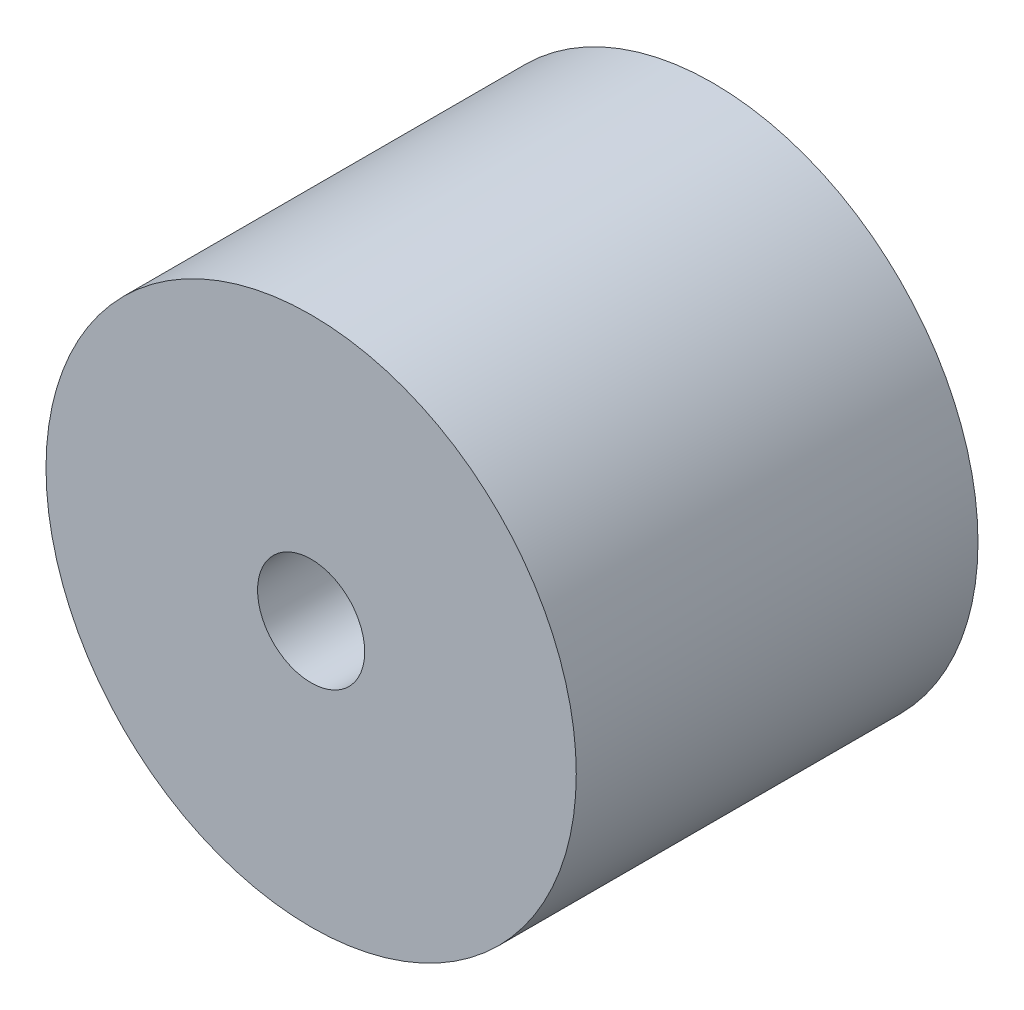
ISO-10303-21;
HEADER;
FILE_DESCRIPTION(('STEP AP214'),'2;1');
FILE_NAME('part.step','',(''),(''),'','','');
FILE_SCHEMA(('AUTOMOTIVE_DESIGN { 1 0 10303 214 1 1 1 1 }'));
ENDSEC;
DATA;
#1=APPLICATION_CONTEXT('core data for automotive mechanical design processes');
#2=APPLICATION_PROTOCOL_DEFINITION('international standard','automotive_design',2000,#1);
#3=PRODUCT_CONTEXT('',#1,'mechanical');
#4=PRODUCT('Part','Part','',(#3));
#5=PRODUCT_RELATED_PRODUCT_CATEGORY('part','',(#4));
#6=PRODUCT_DEFINITION_FORMATION('','',#4);
#7=PRODUCT_DEFINITION_CONTEXT('part definition',#1,'design');
#8=PRODUCT_DEFINITION('design','',#6,#7);
#9=PRODUCT_DEFINITION_SHAPE('','',#8);
#10=(LENGTH_UNIT() NAMED_UNIT(*) SI_UNIT(.MILLI.,.METRE.));
#11=(NAMED_UNIT(*) PLANE_ANGLE_UNIT() SI_UNIT($,.RADIAN.));
#12=(NAMED_UNIT(*) SI_UNIT($,.STERADIAN.) SOLID_ANGLE_UNIT());
#13=UNCERTAINTY_MEASURE_WITH_UNIT(LENGTH_MEASURE(1.E-05),#10,'distance_accuracy_value','');
#14=(GEOMETRIC_REPRESENTATION_CONTEXT(3) GLOBAL_UNCERTAINTY_ASSIGNED_CONTEXT((#13)) GLOBAL_UNIT_ASSIGNED_CONTEXT((#10,
#11,#12)) REPRESENTATION_CONTEXT('',''));
#15=CARTESIAN_POINT('',(0.,0.,0.));
#16=DIRECTION('',(0.,0.,1.));
#17=DIRECTION('',(1.,0.,0.));
#18=AXIS2_PLACEMENT_3D('',#15,#16,#17);
#19=CARTESIAN_POINT('',(0.,0.,15.));
#20=DIRECTION('',(0.,0.,1.));
#21=DIRECTION('',(1.,0.,0.));
#22=AXIS2_PLACEMENT_3D('',#19,#20,#21);
#23=PLANE('',#22);
#24=CARTESIAN_POINT('',(0.,0.,15.));
#25=DIRECTION('',(0.,0.,1.));
#26=DIRECTION('',(1.,0.,0.));
#27=AXIS2_PLACEMENT_3D('',#24,#25,#26);
#28=CIRCLE('',#27,9.9);
#29=CARTESIAN_POINT('',(9.9,0.,15.));
#30=VERTEX_POINT('',#29);
#31=EDGE_CURVE('E10',#30,#30,#28,.T.);
#32=ORIENTED_EDGE('',*,*,#31,.T.);
#33=EDGE_LOOP('',(#32));
#34=FACE_BOUND('',#33,.T.);
#35=CARTESIAN_POINT('',(0.,0.,15.));
#36=DIRECTION('',(0.,0.,1.));
#37=DIRECTION('',(1.,0.,0.));
#38=AXIS2_PLACEMENT_3D('',#35,#36,#37);
#39=CIRCLE('',#38,2.);
#40=CARTESIAN_POINT('',(2.,0.,15.));
#41=VERTEX_POINT('',#40);
#42=EDGE_CURVE('E45',#41,#41,#39,.T.);
#43=ORIENTED_EDGE('',*,*,#42,.F.);
#44=EDGE_LOOP('',(#43));
#45=FACE_BOUND('',#44,.T.);
#46=ADVANCED_FACE('F34',(#34,#45),#23,.T.);
#47=CARTESIAN_POINT('',(0.,0.,0.));
#48=DIRECTION('',(0.,0.,1.));
#49=DIRECTION('',(1.,0.,0.));
#50=AXIS2_PLACEMENT_3D('',#47,#48,#49);
#51=PLANE('',#50);
#52=CARTESIAN_POINT('',(0.,0.,0.));
#53=DIRECTION('',(0.,0.,1.));
#54=DIRECTION('',(1.,0.,0.));
#55=AXIS2_PLACEMENT_3D('',#52,#53,#54);
#56=CIRCLE('',#55,9.9);
#57=CARTESIAN_POINT('',(9.9,0.,0.));
#58=VERTEX_POINT('',#57);
#59=EDGE_CURVE('E38',#58,#58,#56,.T.);
#60=ORIENTED_EDGE('',*,*,#59,.F.);
#61=EDGE_LOOP('',(#60));
#62=FACE_BOUND('',#61,.T.);
#63=CARTESIAN_POINT('',(0.,0.,0.));
#64=DIRECTION('',(0.,0.,1.));
#65=DIRECTION('',(1.,0.,0.));
#66=AXIS2_PLACEMENT_3D('',#63,#64,#65);
#67=CIRCLE('',#66,2.);
#68=CARTESIAN_POINT('',(2.,0.,0.));
#69=VERTEX_POINT('',#68);
#70=EDGE_CURVE('E47',#69,#69,#67,.T.);
#71=ORIENTED_EDGE('',*,*,#70,.T.);
#72=EDGE_LOOP('',(#71));
#73=FACE_BOUND('',#72,.T.);
#74=ADVANCED_FACE('F57',(#62,#73),#51,.F.);
#75=CARTESIAN_POINT('',(0.,0.,15.));
#76=DIRECTION('',(0.,0.,-1.));
#77=DIRECTION('',(-1.,0.,0.));
#78=AXIS2_PLACEMENT_3D('',#75,#76,#77);
#79=CYLINDRICAL_SURFACE('',#78,9.9);
#80=ORIENTED_EDGE('',*,*,#31,.F.);
#81=EDGE_LOOP('',(#80));
#82=FACE_BOUND('',#81,.T.);
#83=ORIENTED_EDGE('',*,*,#59,.T.);
#84=EDGE_LOOP('',(#83));
#85=FACE_BOUND('',#84,.T.);
#86=ADVANCED_FACE('F36',(#82,#85),#79,.T.);
#87=CARTESIAN_POINT('',(0.,0.,15.));
#88=DIRECTION('',(0.,0.,-1.));
#89=DIRECTION('',(-1.,0.,0.));
#90=AXIS2_PLACEMENT_3D('',#87,#88,#89);
#91=CYLINDRICAL_SURFACE('',#90,2.);
#92=ORIENTED_EDGE('',*,*,#42,.T.);
#93=EDGE_LOOP('',(#92));
#94=FACE_BOUND('',#93,.T.);
#95=ORIENTED_EDGE('',*,*,#70,.F.);
#96=EDGE_LOOP('',(#95));
#97=FACE_BOUND('',#96,.T.);
#98=ADVANCED_FACE('F53',(#94,#97),#91,.F.);
#99=CLOSED_SHELL('',(#46,#74,#86,#98));
#100=MANIFOLD_SOLID_BREP('B2',#99);
#101=ADVANCED_BREP_SHAPE_REPRESENTATION('',(#18,#100),#14);
#102=SHAPE_DEFINITION_REPRESENTATION(#9,#101);
ENDSEC;
END-ISO-10303-21;
